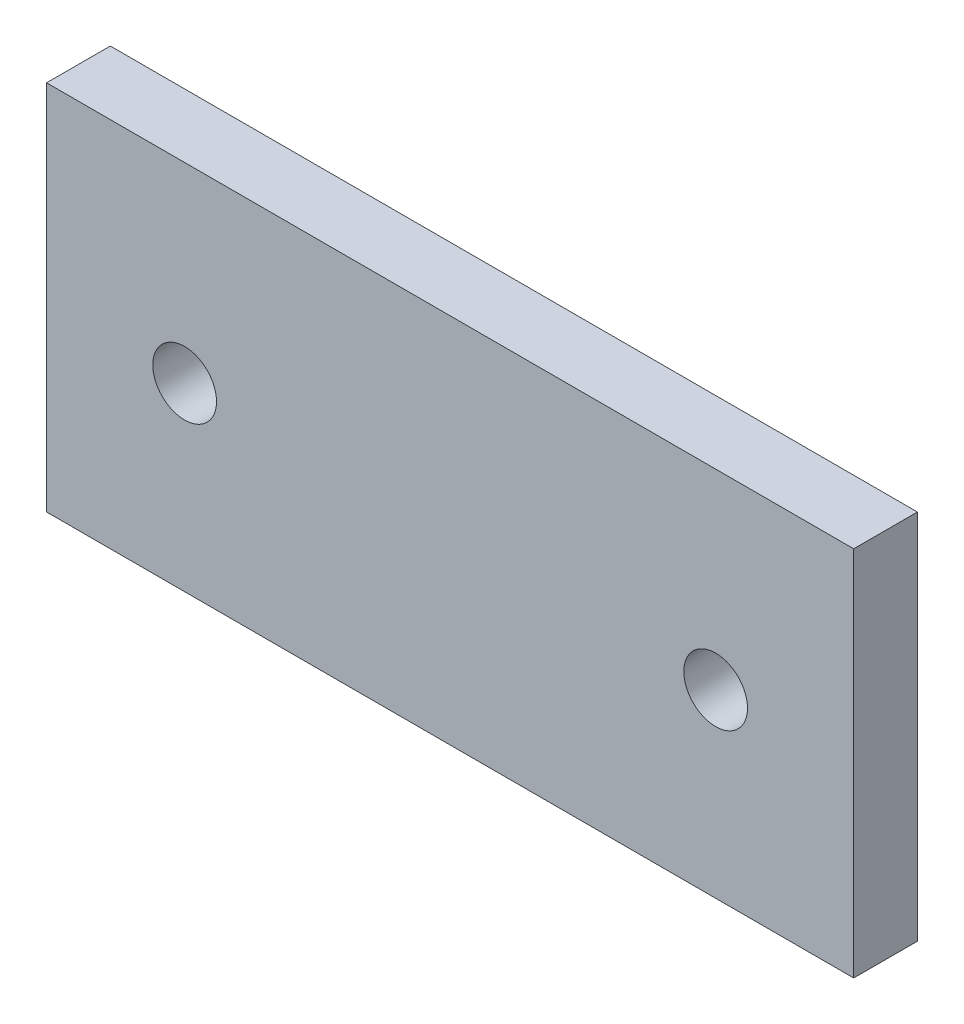
ISO-10303-21;
HEADER;
FILE_DESCRIPTION(('STEP AP214'),'2;1');
FILE_NAME('part.step','',(''),(''),'','','');
FILE_SCHEMA(('AUTOMOTIVE_DESIGN { 1 0 10303 214 1 1 1 1 }'));
ENDSEC;
DATA;
#1=APPLICATION_CONTEXT('core data for automotive mechanical design processes');
#2=APPLICATION_PROTOCOL_DEFINITION('international standard','automotive_design',2000,#1);
#3=PRODUCT_CONTEXT('',#1,'mechanical');
#4=PRODUCT('Part','Part','',(#3));
#5=PRODUCT_RELATED_PRODUCT_CATEGORY('part','',(#4));
#6=PRODUCT_DEFINITION_FORMATION('','',#4);
#7=PRODUCT_DEFINITION_CONTEXT('part definition',#1,'design');
#8=PRODUCT_DEFINITION('design','',#6,#7);
#9=PRODUCT_DEFINITION_SHAPE('','',#8);
#10=(LENGTH_UNIT() NAMED_UNIT(*) SI_UNIT(.MILLI.,.METRE.));
#11=(NAMED_UNIT(*) PLANE_ANGLE_UNIT() SI_UNIT($,.RADIAN.));
#12=(NAMED_UNIT(*) SI_UNIT($,.STERADIAN.) SOLID_ANGLE_UNIT());
#13=UNCERTAINTY_MEASURE_WITH_UNIT(LENGTH_MEASURE(1.E-05),#10,'distance_accuracy_value','');
#14=(GEOMETRIC_REPRESENTATION_CONTEXT(3) GLOBAL_UNCERTAINTY_ASSIGNED_CONTEXT((#13)) GLOBAL_UNIT_ASSIGNED_CONTEXT((#10,
#11,#12)) REPRESENTATION_CONTEXT('',''));
#15=CARTESIAN_POINT('',(0.,0.,0.));
#16=DIRECTION('',(0.,0.,1.));
#17=DIRECTION('',(1.,0.,0.));
#18=AXIS2_PLACEMENT_3D('',#15,#16,#17);
#19=CARTESIAN_POINT('',(0.,0.,6.));
#20=DIRECTION('',(-1.,0.,0.));
#21=DIRECTION('',(0.,-1.,0.));
#22=AXIS2_PLACEMENT_3D('',#19,#20,#21);
#23=PLANE('',#22);
#24=DIRECTION('',(0.,1.,0.));
#25=VECTOR('',#24,1.);
#26=CARTESIAN_POINT('',(0.,0.,0.));
#27=LINE('',#26,#25);
#28=CARTESIAN_POINT('',(0.,0.,0.));
#29=VERTEX_POINT('',#28);
#30=CARTESIAN_POINT('',(0.,35.,0.));
#31=VERTEX_POINT('',#30);
#32=EDGE_CURVE('E107',#29,#31,#27,.T.);
#33=ORIENTED_EDGE('',*,*,#32,.T.);
#34=DIRECTION('',(0.,0.,-1.));
#35=VECTOR('',#34,1.);
#36=CARTESIAN_POINT('',(0.,35.,6.));
#37=LINE('',#36,#35);
#38=CARTESIAN_POINT('',(0.,35.,6.));
#39=VERTEX_POINT('',#38);
#40=EDGE_CURVE('E11',#39,#31,#37,.T.);
#41=ORIENTED_EDGE('',*,*,#40,.F.);
#42=DIRECTION('',(0.,1.,0.));
#43=VECTOR('',#42,1.);
#44=CARTESIAN_POINT('',(0.,0.,6.));
#45=LINE('',#44,#43);
#46=CARTESIAN_POINT('',(0.,0.,6.));
#47=VERTEX_POINT('',#46);
#48=EDGE_CURVE('E91',#47,#39,#45,.T.);
#49=ORIENTED_EDGE('',*,*,#48,.F.);
#50=DIRECTION('',(0.,0.,-1.));
#51=VECTOR('',#50,1.);
#52=CARTESIAN_POINT('',(0.,0.,6.));
#53=LINE('',#52,#51);
#54=EDGE_CURVE('E103',#47,#29,#53,.T.);
#55=ORIENTED_EDGE('',*,*,#54,.T.);
#56=EDGE_LOOP('',(#33,#41,#49,#55));
#57=FACE_BOUND('',#56,.T.);
#58=ADVANCED_FACE('F39',(#57),#23,.F.);
#59=CARTESIAN_POINT('',(0.,35.,6.));
#60=DIRECTION('',(0.,-1.,0.));
#61=DIRECTION('',(1.,0.,0.));
#62=AXIS2_PLACEMENT_3D('',#59,#60,#61);
#63=PLANE('',#62);
#64=DIRECTION('',(-1.,0.,0.));
#65=VECTOR('',#64,1.);
#66=CARTESIAN_POINT('',(0.,35.,0.));
#67=LINE('',#66,#65);
#68=CARTESIAN_POINT('',(-76.,35.,0.));
#69=VERTEX_POINT('',#68);
#70=EDGE_CURVE('E96',#31,#69,#67,.T.);
#71=ORIENTED_EDGE('',*,*,#70,.T.);
#72=DIRECTION('',(0.,0.,-1.));
#73=VECTOR('',#72,1.);
#74=CARTESIAN_POINT('',(-76.,35.,6.));
#75=LINE('',#74,#73);
#76=CARTESIAN_POINT('',(-76.,35.,6.));
#77=VERTEX_POINT('',#76);
#78=EDGE_CURVE('E48',#77,#69,#75,.T.);
#79=ORIENTED_EDGE('',*,*,#78,.F.);
#80=DIRECTION('',(-1.,0.,0.));
#81=VECTOR('',#80,1.);
#82=CARTESIAN_POINT('',(0.,35.,6.));
#83=LINE('',#82,#81);
#84=EDGE_CURVE('E86',#39,#77,#83,.T.);
#85=ORIENTED_EDGE('',*,*,#84,.F.);
#86=ORIENTED_EDGE('',*,*,#40,.T.);
#87=EDGE_LOOP('',(#71,#79,#85,#86));
#88=FACE_BOUND('',#87,.T.);
#89=ADVANCED_FACE('F95',(#88),#63,.F.);
#90=CARTESIAN_POINT('',(-76.,0.,6.));
#91=DIRECTION('',(1.,0.,0.));
#92=DIRECTION('',(0.,0.,-1.));
#93=AXIS2_PLACEMENT_3D('',#90,#91,#92);
#94=PLANE('',#93);
#95=DIRECTION('',(0.,-1.,0.));
#96=VECTOR('',#95,1.);
#97=CARTESIAN_POINT('',(-76.,0.,0.));
#98=LINE('',#97,#96);
#99=CARTESIAN_POINT('',(-76.,0.,0.));
#100=VERTEX_POINT('',#99);
#101=EDGE_CURVE('E73',#69,#100,#98,.T.);
#102=ORIENTED_EDGE('',*,*,#101,.T.);
#103=DIRECTION('',(0.,0.,-1.));
#104=VECTOR('',#103,1.);
#105=CARTESIAN_POINT('',(-76.,0.,6.));
#106=LINE('',#105,#104);
#107=CARTESIAN_POINT('',(-76.,0.,6.));
#108=VERTEX_POINT('',#107);
#109=EDGE_CURVE('E98',#108,#100,#106,.T.);
#110=ORIENTED_EDGE('',*,*,#109,.F.);
#111=DIRECTION('',(0.,-1.,0.));
#112=VECTOR('',#111,1.);
#113=CARTESIAN_POINT('',(-76.,0.,6.));
#114=LINE('',#113,#112);
#115=EDGE_CURVE('E89',#77,#108,#114,.T.);
#116=ORIENTED_EDGE('',*,*,#115,.F.);
#117=ORIENTED_EDGE('',*,*,#78,.T.);
#118=EDGE_LOOP('',(#102,#110,#116,#117));
#119=FACE_BOUND('',#118,.T.);
#120=ADVANCED_FACE('F99',(#119),#94,.F.);
#121=CARTESIAN_POINT('',(0.,0.,6.));
#122=DIRECTION('',(0.,1.,0.));
#123=DIRECTION('',(0.,0.,1.));
#124=AXIS2_PLACEMENT_3D('',#121,#122,#123);
#125=PLANE('',#124);
#126=DIRECTION('',(1.,0.,0.));
#127=VECTOR('',#126,1.);
#128=CARTESIAN_POINT('',(0.,0.,0.));
#129=LINE('',#128,#127);
#130=EDGE_CURVE('E79',#100,#29,#129,.T.);
#131=ORIENTED_EDGE('',*,*,#130,.T.);
#132=ORIENTED_EDGE('',*,*,#54,.F.);
#133=DIRECTION('',(1.,0.,0.));
#134=VECTOR('',#133,1.);
#135=CARTESIAN_POINT('',(0.,0.,6.));
#136=LINE('',#135,#134);
#137=EDGE_CURVE('E56',#108,#47,#136,.T.);
#138=ORIENTED_EDGE('',*,*,#137,.F.);
#139=ORIENTED_EDGE('',*,*,#109,.T.);
#140=EDGE_LOOP('',(#131,#132,#138,#139));
#141=FACE_BOUND('',#140,.T.);
#142=ADVANCED_FACE('F121',(#141),#125,.F.);
#143=CARTESIAN_POINT('',(0.,0.,6.));
#144=DIRECTION('',(0.,0.,1.));
#145=DIRECTION('',(1.,0.,0.));
#146=AXIS2_PLACEMENT_3D('',#143,#144,#145);
#147=PLANE('',#146);
#148=CARTESIAN_POINT('',(-13.,17.,6.));
#149=DIRECTION('',(0.,0.,1.));
#150=DIRECTION('',(1.,0.,0.));
#151=AXIS2_PLACEMENT_3D('',#148,#149,#150);
#152=CIRCLE('',#151,3.);
#153=CARTESIAN_POINT('',(-10.,17.,6.));
#154=VERTEX_POINT('',#153);
#155=EDGE_CURVE('E136',#154,#154,#152,.T.);
#156=ORIENTED_EDGE('',*,*,#155,.F.);
#157=EDGE_LOOP('',(#156));
#158=FACE_BOUND('',#157,.T.);
#159=CARTESIAN_POINT('',(-63.,17.,6.));
#160=DIRECTION('',(0.,0.,1.));
#161=DIRECTION('',(1.,0.,0.));
#162=AXIS2_PLACEMENT_3D('',#159,#160,#161);
#163=CIRCLE('',#162,3.);
#164=CARTESIAN_POINT('',(-60.,17.,6.));
#165=VERTEX_POINT('',#164);
#166=EDGE_CURVE('E128',#165,#165,#163,.T.);
#167=ORIENTED_EDGE('',*,*,#166,.F.);
#168=EDGE_LOOP('',(#167));
#169=FACE_BOUND('',#168,.T.);
#170=ORIENTED_EDGE('',*,*,#48,.T.);
#171=ORIENTED_EDGE('',*,*,#84,.T.);
#172=ORIENTED_EDGE('',*,*,#115,.T.);
#173=ORIENTED_EDGE('',*,*,#137,.T.);
#174=EDGE_LOOP('',(#170,#171,#172,#173));
#175=FACE_BOUND('',#174,.T.);
#176=ADVANCED_FACE('F87',(#158,#169,#175),#147,.T.);
#177=CARTESIAN_POINT('',(0.,0.,0.));
#178=DIRECTION('',(0.,0.,1.));
#179=DIRECTION('',(1.,0.,0.));
#180=AXIS2_PLACEMENT_3D('',#177,#178,#179);
#181=PLANE('',#180);
#182=CARTESIAN_POINT('',(-13.,17.,0.));
#183=DIRECTION('',(0.,0.,1.));
#184=DIRECTION('',(1.,0.,0.));
#185=AXIS2_PLACEMENT_3D('',#182,#183,#184);
#186=CIRCLE('',#185,3.);
#187=CARTESIAN_POINT('',(-10.,17.,0.));
#188=VERTEX_POINT('',#187);
#189=EDGE_CURVE('E111',#188,#188,#186,.T.);
#190=ORIENTED_EDGE('',*,*,#189,.T.);
#191=EDGE_LOOP('',(#190));
#192=FACE_BOUND('',#191,.T.);
#193=CARTESIAN_POINT('',(-63.,17.,0.));
#194=DIRECTION('',(0.,0.,1.));
#195=DIRECTION('',(1.,0.,0.));
#196=AXIS2_PLACEMENT_3D('',#193,#194,#195);
#197=CIRCLE('',#196,3.);
#198=CARTESIAN_POINT('',(-60.,17.,0.));
#199=VERTEX_POINT('',#198);
#200=EDGE_CURVE('E132',#199,#199,#197,.T.);
#201=ORIENTED_EDGE('',*,*,#200,.T.);
#202=EDGE_LOOP('',(#201));
#203=FACE_BOUND('',#202,.T.);
#204=ORIENTED_EDGE('',*,*,#32,.F.);
#205=ORIENTED_EDGE('',*,*,#130,.F.);
#206=ORIENTED_EDGE('',*,*,#101,.F.);
#207=ORIENTED_EDGE('',*,*,#70,.F.);
#208=EDGE_LOOP('',(#204,#205,#206,#207));
#209=FACE_BOUND('',#208,.T.);
#210=ADVANCED_FACE('F124',(#192,#203,#209),#181,.F.);
#211=CARTESIAN_POINT('',(-63.,17.,0.));
#212=DIRECTION('',(0.,0.,1.));
#213=DIRECTION('',(1.,0.,0.));
#214=AXIS2_PLACEMENT_3D('',#211,#212,#213);
#215=CYLINDRICAL_SURFACE('',#214,3.);
#216=ORIENTED_EDGE('',*,*,#200,.F.);
#217=EDGE_LOOP('',(#216));
#218=FACE_BOUND('',#217,.T.);
#219=ORIENTED_EDGE('',*,*,#166,.T.);
#220=EDGE_LOOP('',(#219));
#221=FACE_BOUND('',#220,.T.);
#222=ADVANCED_FACE('F149',(#218,#221),#215,.F.);
#223=CARTESIAN_POINT('',(-13.,17.,0.));
#224=DIRECTION('',(0.,0.,1.));
#225=DIRECTION('',(1.,0.,0.));
#226=AXIS2_PLACEMENT_3D('',#223,#224,#225);
#227=CYLINDRICAL_SURFACE('',#226,3.);
#228=ORIENTED_EDGE('',*,*,#189,.F.);
#229=EDGE_LOOP('',(#228));
#230=FACE_BOUND('',#229,.T.);
#231=ORIENTED_EDGE('',*,*,#155,.T.);
#232=EDGE_LOOP('',(#231));
#233=FACE_BOUND('',#232,.T.);
#234=ADVANCED_FACE('F146',(#230,#233),#227,.F.);
#235=CLOSED_SHELL('',(#58,#89,#120,#142,#176,#210,#222,#234));
#236=MANIFOLD_SOLID_BREP('B2',#235);
#237=ADVANCED_BREP_SHAPE_REPRESENTATION('',(#18,#236),#14);
#238=SHAPE_DEFINITION_REPRESENTATION(#9,#237);
ENDSEC;
END-ISO-10303-21;
